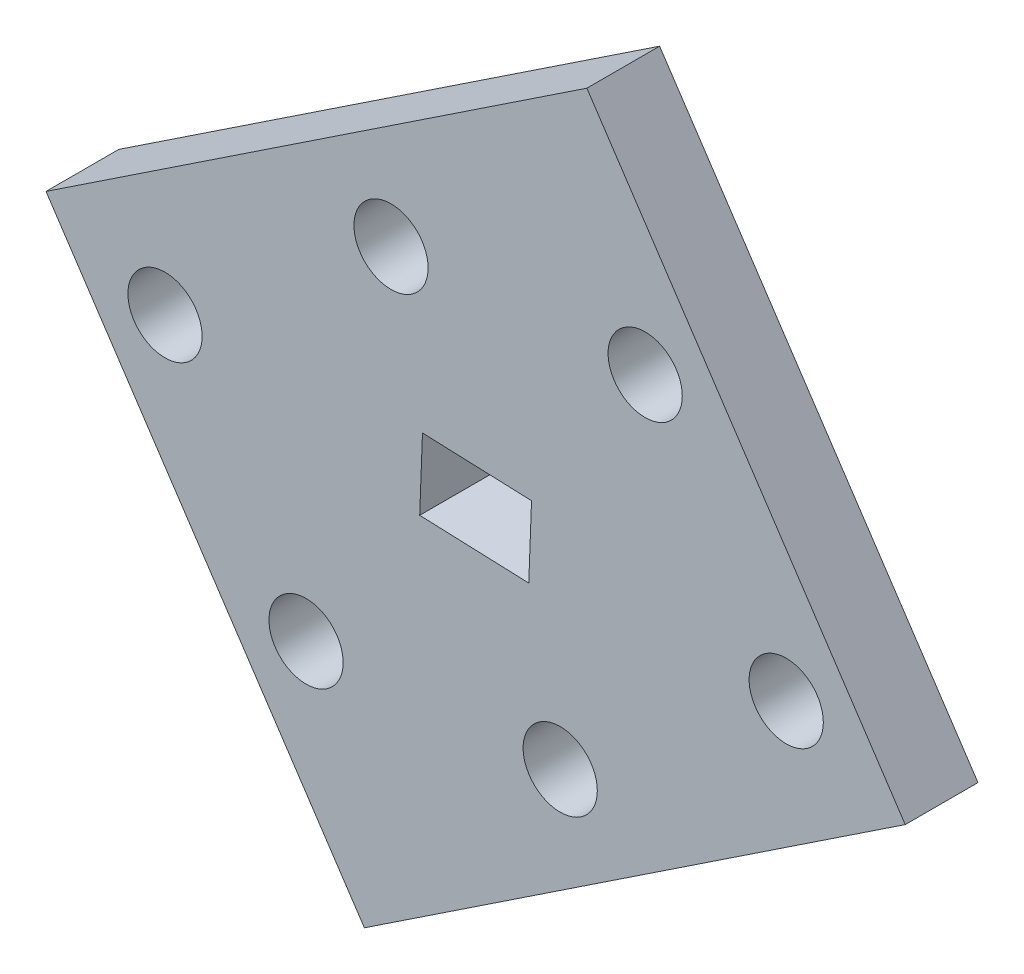
ISO-10303-21;
HEADER;
FILE_DESCRIPTION(('STEP AP214'),'2;1');
FILE_NAME('part.step','',(''),(''),'','','');
FILE_SCHEMA(('AUTOMOTIVE_DESIGN { 1 0 10303 214 1 1 1 1 }'));
ENDSEC;
DATA;
#1=APPLICATION_CONTEXT('core data for automotive mechanical design processes');
#2=APPLICATION_PROTOCOL_DEFINITION('international standard','automotive_design',2000,#1);
#3=PRODUCT_CONTEXT('',#1,'mechanical');
#4=PRODUCT('Part','Part','',(#3));
#5=PRODUCT_RELATED_PRODUCT_CATEGORY('part','',(#4));
#6=PRODUCT_DEFINITION_FORMATION('','',#4);
#7=PRODUCT_DEFINITION_CONTEXT('part definition',#1,'design');
#8=PRODUCT_DEFINITION('design','',#6,#7);
#9=PRODUCT_DEFINITION_SHAPE('','',#8);
#10=(LENGTH_UNIT() NAMED_UNIT(*) SI_UNIT(.MILLI.,.METRE.));
#11=(NAMED_UNIT(*) PLANE_ANGLE_UNIT() SI_UNIT($,.RADIAN.));
#12=(NAMED_UNIT(*) SI_UNIT($,.STERADIAN.) SOLID_ANGLE_UNIT());
#13=UNCERTAINTY_MEASURE_WITH_UNIT(LENGTH_MEASURE(1.E-05),#10,'distance_accuracy_value','');
#14=(GEOMETRIC_REPRESENTATION_CONTEXT(3) GLOBAL_UNCERTAINTY_ASSIGNED_CONTEXT((#13)) GLOBAL_UNIT_ASSIGNED_CONTEXT((#10,
#11,#12)) REPRESENTATION_CONTEXT('',''));
#15=CARTESIAN_POINT('',(0.,0.,0.));
#16=DIRECTION('',(0.,0.,1.));
#17=DIRECTION('',(1.,0.,0.));
#18=AXIS2_PLACEMENT_3D('',#15,#16,#17);
#19=CARTESIAN_POINT('',(-3.66198105174916,-82.9081585743082,-10.));
#20=DIRECTION('',(-0.832588078820921,-0.553892671016044,0.));
#21=DIRECTION('',(0.553892671016044,-0.832588078820921,0.));
#22=AXIS2_PLACEMENT_3D('',#19,#20,#21);
#23=PLANE('',#22);
#24=DIRECTION('',(0.553892671016044,-0.832588078820921,0.));
#25=VECTOR('',#24,1.);
#26=CARTESIAN_POINT('',(-3.66198105174916,-82.9081585743082,0.));
#27=LINE('',#26,#25);
#28=CARTESIAN_POINT('',(-47.4195020620167,-17.1337003474554,0.));
#29=VERTEX_POINT('',#28);
#30=CARTESIAN_POINT('',(-3.66198105174916,-82.9081585743082,0.));
#31=VERTEX_POINT('',#30);
#32=EDGE_CURVE('E166',#29,#31,#27,.T.);
#33=ORIENTED_EDGE('',*,*,#32,.F.);
#34=DIRECTION('',(0.,0.,1.));
#35=VECTOR('',#34,1.);
#36=CARTESIAN_POINT('',(-47.4195020620167,-17.1337003474554,-10.));
#37=LINE('',#36,#35);
#38=CARTESIAN_POINT('',(-47.4195020620167,-17.1337003474554,-10.));
#39=VERTEX_POINT('',#38);
#40=EDGE_CURVE('E11',#39,#29,#37,.T.);
#41=ORIENTED_EDGE('',*,*,#40,.F.);
#42=DIRECTION('',(0.553892671016044,-0.832588078820921,0.));
#43=VECTOR('',#42,1.);
#44=CARTESIAN_POINT('',(-3.66198105174916,-82.9081585743082,-10.));
#45=LINE('',#44,#43);
#46=CARTESIAN_POINT('',(-3.66198105174916,-82.9081585743082,-10.));
#47=VERTEX_POINT('',#46);
#48=EDGE_CURVE('E169',#39,#47,#45,.T.);
#49=ORIENTED_EDGE('',*,*,#48,.T.);
#50=DIRECTION('',(0.,0.,1.));
#51=VECTOR('',#50,1.);
#52=CARTESIAN_POINT('',(-3.66198105174916,-82.9081585743082,-10.));
#53=LINE('',#52,#51);
#54=EDGE_CURVE('E36',#47,#31,#53,.T.);
#55=ORIENTED_EDGE('',*,*,#54,.T.);
#56=EDGE_LOOP('',(#33,#41,#49,#55));
#57=FACE_BOUND('',#56,.T.);
#58=ADVANCED_FACE('F33',(#57),#23,.T.);
#59=CARTESIAN_POINT('',(-47.4195020620167,-17.1337003474554,-10.));
#60=DIRECTION('',(-0.553892671016044,0.832588078820921,0.));
#61=DIRECTION('',(-0.832588078820921,-0.553892671016044,0.));
#62=AXIS2_PLACEMENT_3D('',#59,#60,#61);
#63=PLANE('',#62);
#64=DIRECTION('',(-0.832588078820921,-0.553892671016044,0.));
#65=VECTOR('',#64,1.);
#66=CARTESIAN_POINT('',(-47.4195020620167,-17.1337003474554,0.));
#67=LINE('',#66,#65);
#68=CARTESIAN_POINT('',(26.9156536861616,32.3189629984584,0.));
#69=VERTEX_POINT('',#68);
#70=EDGE_CURVE('E173',#69,#29,#67,.T.);
#71=ORIENTED_EDGE('',*,*,#70,.F.);
#72=DIRECTION('',(0.,0.,1.));
#73=VECTOR('',#72,1.);
#74=CARTESIAN_POINT('',(26.9156536861616,32.3189629984584,-10.));
#75=LINE('',#74,#73);
#76=CARTESIAN_POINT('',(26.9156536861616,32.3189629984584,-10.));
#77=VERTEX_POINT('',#76);
#78=EDGE_CURVE('E41',#77,#69,#75,.T.);
#79=ORIENTED_EDGE('',*,*,#78,.F.);
#80=DIRECTION('',(-0.832588078820921,-0.553892671016044,0.));
#81=VECTOR('',#80,1.);
#82=CARTESIAN_POINT('',(-47.4195020620167,-17.1337003474554,-10.));
#83=LINE('',#82,#81);
#84=EDGE_CURVE('E179',#77,#39,#83,.T.);
#85=ORIENTED_EDGE('',*,*,#84,.T.);
#86=ORIENTED_EDGE('',*,*,#40,.T.);
#87=EDGE_LOOP('',(#71,#79,#85,#86));
#88=FACE_BOUND('',#87,.T.);
#89=ADVANCED_FACE('F205',(#88),#63,.T.);
#90=CARTESIAN_POINT('',(70.6731746964291,-33.4554952283944,-10.));
#91=DIRECTION('',(0.832588078820921,0.553892671016044,0.));
#92=DIRECTION('',(-0.553892671016044,0.832588078820921,0.));
#93=AXIS2_PLACEMENT_3D('',#90,#91,#92);
#94=PLANE('',#93);
#95=DIRECTION('',(-0.553892671016044,0.832588078820921,0.));
#96=VECTOR('',#95,1.);
#97=CARTESIAN_POINT('',(70.6731746964291,-33.4554952283944,0.));
#98=LINE('',#97,#96);
#99=CARTESIAN_POINT('',(70.6731746964291,-33.4554952283944,0.));
#100=VERTEX_POINT('',#99);
#101=EDGE_CURVE('E187',#100,#69,#98,.T.);
#102=ORIENTED_EDGE('',*,*,#101,.F.);
#103=DIRECTION('',(0.,0.,1.));
#104=VECTOR('',#103,1.);
#105=CARTESIAN_POINT('',(70.6731746964291,-33.4554952283944,-10.));
#106=LINE('',#105,#104);
#107=CARTESIAN_POINT('',(70.6731746964291,-33.4554952283944,-10.));
#108=VERTEX_POINT('',#107);
#109=EDGE_CURVE('E192',#108,#100,#106,.T.);
#110=ORIENTED_EDGE('',*,*,#109,.F.);
#111=DIRECTION('',(-0.553892671016044,0.832588078820921,0.));
#112=VECTOR('',#111,1.);
#113=CARTESIAN_POINT('',(70.6731746964291,-33.4554952283944,-10.));
#114=LINE('',#113,#112);
#115=EDGE_CURVE('E176',#108,#77,#114,.T.);
#116=ORIENTED_EDGE('',*,*,#115,.T.);
#117=ORIENTED_EDGE('',*,*,#78,.T.);
#118=EDGE_LOOP('',(#102,#110,#116,#117));
#119=FACE_BOUND('',#118,.T.);
#120=ADVANCED_FACE('F210',(#119),#94,.T.);
#121=CARTESIAN_POINT('',(-3.66198105174916,-82.9081585743082,-10.));
#122=DIRECTION('',(0.553892671016044,-0.832588078820921,0.));
#123=DIRECTION('',(0.832588078820921,0.553892671016044,0.));
#124=AXIS2_PLACEMENT_3D('',#121,#122,#123);
#125=PLANE('',#124);
#126=DIRECTION('',(0.832588078820921,0.553892671016044,0.));
#127=VECTOR('',#126,1.);
#128=CARTESIAN_POINT('',(-3.66198105174916,-82.9081585743082,0.));
#129=LINE('',#128,#127);
#130=EDGE_CURVE('E184',#31,#100,#129,.T.);
#131=ORIENTED_EDGE('',*,*,#130,.F.);
#132=ORIENTED_EDGE('',*,*,#54,.F.);
#133=DIRECTION('',(0.832588078820921,0.553892671016044,0.));
#134=VECTOR('',#133,1.);
#135=CARTESIAN_POINT('',(-3.66198105174916,-82.9081585743082,-10.));
#136=LINE('',#135,#134);
#137=EDGE_CURVE('E172',#47,#108,#136,.T.);
#138=ORIENTED_EDGE('',*,*,#137,.T.);
#139=ORIENTED_EDGE('',*,*,#109,.T.);
#140=EDGE_LOOP('',(#131,#132,#138,#139));
#141=FACE_BOUND('',#140,.T.);
#142=ADVANCED_FACE('F200',(#141),#125,.T.);
#143=CARTESIAN_POINT('',(0.,0.,-10.));
#144=DIRECTION('',(0.,0.,-1.));
#145=DIRECTION('',(-1.,0.,0.));
#146=AXIS2_PLACEMENT_3D('',#143,#144,#145);
#147=PLANE('',#146);
#148=DIRECTION('',(-0.0380921417226303,-0.99927423099917,0.));
#149=VECTOR('',#148,1.);
#150=CARTESIAN_POINT('',(4.32274029332557,-20.0125355700093,-10.));
#151=LINE('',#150,#149);
#152=CARTESIAN_POINT('',(4.32274029332557,-20.0125355700093,-10.));
#153=VERTEX_POINT('',#152);
#154=CARTESIAN_POINT('',(3.94181887609927,-30.005277880001,-10.));
#155=VERTEX_POINT('',#154);
#156=EDGE_CURVE('E108',#153,#155,#151,.T.);
#157=ORIENTED_EDGE('',*,*,#156,.T.);
#158=DIRECTION('',(0.99927423099917,-0.0380921417226301,0.));
#159=VECTOR('',#158,1.);
#160=CARTESIAN_POINT('',(3.94181887609927,-30.005277880001,-10.));
#161=LINE('',#160,#159);
#162=CARTESIAN_POINT('',(18.9309323410868,-30.5766600058405,-10.));
#163=VERTEX_POINT('',#162);
#164=EDGE_CURVE('E97',#155,#163,#161,.T.);
#165=ORIENTED_EDGE('',*,*,#164,.T.);
#166=DIRECTION('',(0.0380921417226301,0.99927423099917,0.));
#167=VECTOR('',#166,1.);
#168=CARTESIAN_POINT('',(19.3118537583131,-20.5839176958488,-10.));
#169=LINE('',#168,#167);
#170=CARTESIAN_POINT('',(19.3118537583131,-20.5839176958488,-10.));
#171=VERTEX_POINT('',#170);
#172=EDGE_CURVE('E119',#163,#171,#169,.T.);
#173=ORIENTED_EDGE('',*,*,#172,.T.);
#174=DIRECTION('',(-0.99927423099917,0.0380921417226299,0.));
#175=VECTOR('',#174,1.);
#176=CARTESIAN_POINT('',(4.32274029332557,-20.0125355700093,-10.));
#177=LINE('',#176,#175);
#178=EDGE_CURVE('E115',#171,#153,#177,.T.);
#179=ORIENTED_EDGE('',*,*,#178,.T.);
#180=EDGE_LOOP('',(#157,#165,#173,#179));
#181=FACE_BOUND('',#180,.T.);
#182=CARTESIAN_POINT('',(-31.0621775440748,-23.6673007801983,-10.));
#183=DIRECTION('',(0.,0.,1.));
#184=DIRECTION('',(1.,0.,0.));
#185=AXIS2_PLACEMENT_3D('',#182,#183,#184);
#186=CIRCLE('',#185,5.1);
#187=CARTESIAN_POINT('',(-25.9621775440748,-23.6673007801983,-10.));
#188=VERTEX_POINT('',#187);
#189=EDGE_CURVE('E133',#188,#188,#186,.T.);
#190=ORIENTED_EDGE('',*,*,#189,.T.);
#191=EDGE_LOOP('',(#190));
#192=FACE_BOUND('',#191,.T.);
#193=CARTESIAN_POINT('',(-11.6759340585133,-52.8078835389305,-10.));
#194=DIRECTION('',(0.,0.,1.));
#195=DIRECTION('',(1.,0.,0.));
#196=AXIS2_PLACEMENT_3D('',#193,#194,#195);
#197=CIRCLE('',#196,5.1);
#198=CARTESIAN_POINT('',(-6.57593405851329,-52.8078835389305,-10.));
#199=VERTEX_POINT('',#198);
#200=EDGE_CURVE('E139',#199,#199,#197,.T.);
#201=ORIENTED_EDGE('',*,*,#200,.T.);
#202=EDGE_LOOP('',(#201));
#203=FACE_BOUND('',#202,.T.);
#204=CARTESIAN_POINT('',(23.2536726344124,-50.5891955758498,-10.));
#205=DIRECTION('',(0.,0.,1.));
#206=DIRECTION('',(1.,0.,0.));
#207=AXIS2_PLACEMENT_3D('',#204,#205,#206);
#208=CIRCLE('',#207,5.1);
#209=CARTESIAN_POINT('',(28.3536726344124,-50.5891955758498,-10.));
#210=VERTEX_POINT('',#209);
#211=EDGE_CURVE('E145',#210,#210,#208,.T.);
#212=ORIENTED_EDGE('',*,*,#211,.T.);
#213=EDGE_LOOP('',(#212));
#214=FACE_BOUND('',#213,.T.);
#215=CARTESIAN_POINT('',(54.3158501784872,-26.9218947956515,-10.));
#216=DIRECTION('',(0.,0.,1.));
#217=DIRECTION('',(1.,0.,0.));
#218=AXIS2_PLACEMENT_3D('',#215,#216,#217);
#219=CIRCLE('',#218,5.1000000000002);
#220=CARTESIAN_POINT('',(59.4158501784874,-26.9218947956515,-10.));
#221=VERTEX_POINT('',#220);
#222=EDGE_CURVE('E151',#221,#221,#219,.T.);
#223=ORIENTED_EDGE('',*,*,#222,.T.);
#224=EDGE_LOOP('',(#223));
#225=FACE_BOUND('',#224,.T.);
#226=CARTESIAN_POINT('',(34.9296066929257,2.21868796308074,-10.));
#227=DIRECTION('',(0.,0.,1.));
#228=DIRECTION('',(1.,0.,0.));
#229=AXIS2_PLACEMENT_3D('',#226,#227,#228);
#230=CIRCLE('',#229,5.10000000000001);
#231=CARTESIAN_POINT('',(40.0296066929257,2.21868796308074,-10.));
#232=VERTEX_POINT('',#231);
#233=EDGE_CURVE('E157',#232,#232,#230,.T.);
#234=ORIENTED_EDGE('',*,*,#233,.T.);
#235=EDGE_LOOP('',(#234));
#236=FACE_BOUND('',#235,.T.);
#237=CARTESIAN_POINT('',(0.,0.,-10.));
#238=DIRECTION('',(0.,0.,1.));
#239=DIRECTION('',(1.,0.,0.));
#240=AXIS2_PLACEMENT_3D('',#237,#238,#239);
#241=CIRCLE('',#240,5.10000000000001);
#242=CARTESIAN_POINT('',(5.1,0.,-10.));
#243=VERTEX_POINT('',#242);
#244=EDGE_CURVE('E163',#243,#243,#241,.T.);
#245=ORIENTED_EDGE('',*,*,#244,.T.);
#246=EDGE_LOOP('',(#245));
#247=FACE_BOUND('',#246,.T.);
#248=ORIENTED_EDGE('',*,*,#48,.F.);
#249=ORIENTED_EDGE('',*,*,#84,.F.);
#250=ORIENTED_EDGE('',*,*,#115,.F.);
#251=ORIENTED_EDGE('',*,*,#137,.F.);
#252=EDGE_LOOP('',(#248,#249,#250,#251));
#253=FACE_BOUND('',#252,.T.);
#254=ADVANCED_FACE('F113',(#181,#192,#203,#214,#225,#236,#247,#253),#147,.T.);
#255=CARTESIAN_POINT('',(0.,0.,0.));
#256=DIRECTION('',(0.,0.,-1.));
#257=DIRECTION('',(-1.,0.,0.));
#258=AXIS2_PLACEMENT_3D('',#255,#256,#257);
#259=PLANE('',#258);
#260=DIRECTION('',(0.99927423099917,-0.0380921417226301,0.));
#261=VECTOR('',#260,1.);
#262=CARTESIAN_POINT('',(3.94181887609927,-30.005277880001,0.));
#263=LINE('',#262,#261);
#264=CARTESIAN_POINT('',(3.94181887609927,-30.005277880001,0.));
#265=VERTEX_POINT('',#264);
#266=CARTESIAN_POINT('',(18.9309323410868,-30.5766600058405,0.));
#267=VERTEX_POINT('',#266);
#268=EDGE_CURVE('E117',#265,#267,#263,.T.);
#269=ORIENTED_EDGE('',*,*,#268,.F.);
#270=DIRECTION('',(-0.0380921417226303,-0.99927423099917,0.));
#271=VECTOR('',#270,1.);
#272=CARTESIAN_POINT('',(4.32274029332557,-20.0125355700093,0.));
#273=LINE('',#272,#271);
#274=CARTESIAN_POINT('',(4.32274029332557,-20.0125355700093,0.));
#275=VERTEX_POINT('',#274);
#276=EDGE_CURVE('E57',#275,#265,#273,.T.);
#277=ORIENTED_EDGE('',*,*,#276,.F.);
#278=DIRECTION('',(-0.99927423099917,0.0380921417226299,0.));
#279=VECTOR('',#278,1.);
#280=CARTESIAN_POINT('',(4.32274029332557,-20.0125355700093,0.));
#281=LINE('',#280,#279);
#282=CARTESIAN_POINT('',(19.3118537583131,-20.5839176958488,0.));
#283=VERTEX_POINT('',#282);
#284=EDGE_CURVE('E110',#283,#275,#281,.T.);
#285=ORIENTED_EDGE('',*,*,#284,.F.);
#286=DIRECTION('',(0.0380921417226301,0.99927423099917,0.));
#287=VECTOR('',#286,1.);
#288=CARTESIAN_POINT('',(19.3118537583131,-20.5839176958488,0.));
#289=LINE('',#288,#287);
#290=EDGE_CURVE('E124',#267,#283,#289,.T.);
#291=ORIENTED_EDGE('',*,*,#290,.F.);
#292=EDGE_LOOP('',(#269,#277,#285,#291));
#293=FACE_BOUND('',#292,.T.);
#294=CARTESIAN_POINT('',(-31.0621775440748,-23.6673007801983,0.));
#295=DIRECTION('',(0.,0.,1.));
#296=DIRECTION('',(1.,0.,0.));
#297=AXIS2_PLACEMENT_3D('',#294,#295,#296);
#298=CIRCLE('',#297,5.1);
#299=CARTESIAN_POINT('',(-25.9621775440748,-23.6673007801983,0.));
#300=VERTEX_POINT('',#299);
#301=EDGE_CURVE('E104',#300,#300,#298,.T.);
#302=ORIENTED_EDGE('',*,*,#301,.F.);
#303=EDGE_LOOP('',(#302));
#304=FACE_BOUND('',#303,.T.);
#305=CARTESIAN_POINT('',(-11.6759340585133,-52.8078835389305,0.));
#306=DIRECTION('',(0.,0.,1.));
#307=DIRECTION('',(1.,0.,0.));
#308=AXIS2_PLACEMENT_3D('',#305,#306,#307);
#309=CIRCLE('',#308,5.1);
#310=CARTESIAN_POINT('',(-6.57593405851329,-52.8078835389305,0.));
#311=VERTEX_POINT('',#310);
#312=EDGE_CURVE('E136',#311,#311,#309,.T.);
#313=ORIENTED_EDGE('',*,*,#312,.F.);
#314=EDGE_LOOP('',(#313));
#315=FACE_BOUND('',#314,.T.);
#316=CARTESIAN_POINT('',(23.2536726344124,-50.5891955758498,0.));
#317=DIRECTION('',(0.,0.,1.));
#318=DIRECTION('',(1.,0.,0.));
#319=AXIS2_PLACEMENT_3D('',#316,#317,#318);
#320=CIRCLE('',#319,5.1);
#321=CARTESIAN_POINT('',(28.3536726344124,-50.5891955758498,0.));
#322=VERTEX_POINT('',#321);
#323=EDGE_CURVE('E142',#322,#322,#320,.T.);
#324=ORIENTED_EDGE('',*,*,#323,.F.);
#325=EDGE_LOOP('',(#324));
#326=FACE_BOUND('',#325,.T.);
#327=CARTESIAN_POINT('',(54.3158501784872,-26.9218947956515,0.));
#328=DIRECTION('',(0.,0.,1.));
#329=DIRECTION('',(1.,0.,0.));
#330=AXIS2_PLACEMENT_3D('',#327,#328,#329);
#331=CIRCLE('',#330,5.1000000000002);
#332=CARTESIAN_POINT('',(59.4158501784874,-26.9218947956515,0.));
#333=VERTEX_POINT('',#332);
#334=EDGE_CURVE('E148',#333,#333,#331,.T.);
#335=ORIENTED_EDGE('',*,*,#334,.F.);
#336=EDGE_LOOP('',(#335));
#337=FACE_BOUND('',#336,.T.);
#338=CARTESIAN_POINT('',(34.9296066929257,2.21868796308074,0.));
#339=DIRECTION('',(0.,0.,1.));
#340=DIRECTION('',(1.,0.,0.));
#341=AXIS2_PLACEMENT_3D('',#338,#339,#340);
#342=CIRCLE('',#341,5.10000000000001);
#343=CARTESIAN_POINT('',(40.0296066929257,2.21868796308074,0.));
#344=VERTEX_POINT('',#343);
#345=EDGE_CURVE('E154',#344,#344,#342,.T.);
#346=ORIENTED_EDGE('',*,*,#345,.F.);
#347=EDGE_LOOP('',(#346));
#348=FACE_BOUND('',#347,.T.);
#349=CARTESIAN_POINT('',(0.,0.,0.));
#350=DIRECTION('',(0.,0.,1.));
#351=DIRECTION('',(1.,0.,0.));
#352=AXIS2_PLACEMENT_3D('',#349,#350,#351);
#353=CIRCLE('',#352,5.10000000000001);
#354=CARTESIAN_POINT('',(5.1,0.,0.));
#355=VERTEX_POINT('',#354);
#356=EDGE_CURVE('E160',#355,#355,#353,.T.);
#357=ORIENTED_EDGE('',*,*,#356,.F.);
#358=EDGE_LOOP('',(#357));
#359=FACE_BOUND('',#358,.T.);
#360=ORIENTED_EDGE('',*,*,#32,.T.);
#361=ORIENTED_EDGE('',*,*,#130,.T.);
#362=ORIENTED_EDGE('',*,*,#101,.T.);
#363=ORIENTED_EDGE('',*,*,#70,.T.);
#364=EDGE_LOOP('',(#360,#361,#362,#363));
#365=FACE_BOUND('',#364,.T.);
#366=ADVANCED_FACE('F202',(#293,#304,#315,#326,#337,#348,#359,#365),#259,.F.);
#367=CARTESIAN_POINT('',(0.,0.,-10.));
#368=DIRECTION('',(0.,0.,1.));
#369=DIRECTION('',(1.,0.,0.));
#370=AXIS2_PLACEMENT_3D('',#367,#368,#369);
#371=CYLINDRICAL_SURFACE('',#370,5.10000000000001);
#372=ORIENTED_EDGE('',*,*,#244,.F.);
#373=EDGE_LOOP('',(#372));
#374=FACE_BOUND('',#373,.T.);
#375=ORIENTED_EDGE('',*,*,#356,.T.);
#376=EDGE_LOOP('',(#375));
#377=FACE_BOUND('',#376,.T.);
#378=ADVANCED_FACE('F242',(#374,#377),#371,.F.);
#379=CARTESIAN_POINT('',(34.9296066929257,2.21868796308074,-10.));
#380=DIRECTION('',(0.,0.,1.));
#381=DIRECTION('',(1.,0.,0.));
#382=AXIS2_PLACEMENT_3D('',#379,#380,#381);
#383=CYLINDRICAL_SURFACE('',#382,5.10000000000001);
#384=ORIENTED_EDGE('',*,*,#233,.F.);
#385=EDGE_LOOP('',(#384));
#386=FACE_BOUND('',#385,.T.);
#387=ORIENTED_EDGE('',*,*,#345,.T.);
#388=EDGE_LOOP('',(#387));
#389=FACE_BOUND('',#388,.T.);
#390=ADVANCED_FACE('F247',(#386,#389),#383,.F.);
#391=CARTESIAN_POINT('',(54.3158501784872,-26.9218947956515,-10.));
#392=DIRECTION('',(0.,0.,1.));
#393=DIRECTION('',(1.,0.,0.));
#394=AXIS2_PLACEMENT_3D('',#391,#392,#393);
#395=CYLINDRICAL_SURFACE('',#394,5.1000000000002);
#396=ORIENTED_EDGE('',*,*,#222,.F.);
#397=EDGE_LOOP('',(#396));
#398=FACE_BOUND('',#397,.T.);
#399=ORIENTED_EDGE('',*,*,#334,.T.);
#400=EDGE_LOOP('',(#399));
#401=FACE_BOUND('',#400,.T.);
#402=ADVANCED_FACE('F259',(#398,#401),#395,.F.);
#403=CARTESIAN_POINT('',(23.2536726344124,-50.5891955758498,-10.));
#404=DIRECTION('',(0.,0.,1.));
#405=DIRECTION('',(1.,0.,0.));
#406=AXIS2_PLACEMENT_3D('',#403,#404,#405);
#407=CYLINDRICAL_SURFACE('',#406,5.1);
#408=ORIENTED_EDGE('',*,*,#211,.F.);
#409=EDGE_LOOP('',(#408));
#410=FACE_BOUND('',#409,.T.);
#411=ORIENTED_EDGE('',*,*,#323,.T.);
#412=EDGE_LOOP('',(#411));
#413=FACE_BOUND('',#412,.T.);
#414=ADVANCED_FACE('F269',(#410,#413),#407,.F.);
#415=CARTESIAN_POINT('',(-11.6759340585133,-52.8078835389305,-10.));
#416=DIRECTION('',(0.,0.,1.));
#417=DIRECTION('',(1.,0.,0.));
#418=AXIS2_PLACEMENT_3D('',#415,#416,#417);
#419=CYLINDRICAL_SURFACE('',#418,5.1);
#420=ORIENTED_EDGE('',*,*,#200,.F.);
#421=EDGE_LOOP('',(#420));
#422=FACE_BOUND('',#421,.T.);
#423=ORIENTED_EDGE('',*,*,#312,.T.);
#424=EDGE_LOOP('',(#423));
#425=FACE_BOUND('',#424,.T.);
#426=ADVANCED_FACE('F279',(#422,#425),#419,.F.);
#427=CARTESIAN_POINT('',(-31.0621775440748,-23.6673007801983,-10.));
#428=DIRECTION('',(0.,0.,1.));
#429=DIRECTION('',(1.,0.,0.));
#430=AXIS2_PLACEMENT_3D('',#427,#428,#429);
#431=CYLINDRICAL_SURFACE('',#430,5.1);
#432=ORIENTED_EDGE('',*,*,#189,.F.);
#433=EDGE_LOOP('',(#432));
#434=FACE_BOUND('',#433,.T.);
#435=ORIENTED_EDGE('',*,*,#301,.T.);
#436=EDGE_LOOP('',(#435));
#437=FACE_BOUND('',#436,.T.);
#438=ADVANCED_FACE('F289',(#434,#437),#431,.F.);
#439=CARTESIAN_POINT('',(4.32274029332557,-20.0125355700093,-10.001));
#440=DIRECTION('',(-0.99927423099917,0.0380921417226303,0.));
#441=DIRECTION('',(-0.0380921417226303,-0.99927423099917,0.));
#442=AXIS2_PLACEMENT_3D('',#439,#440,#441);
#443=PLANE('',#442);
#444=DIRECTION('',(0.,0.,1.));
#445=VECTOR('',#444,1.);
#446=CARTESIAN_POINT('',(4.32274029332557,-20.0125355700093,-10.001));
#447=LINE('',#446,#445);
#448=EDGE_CURVE('E105',#153,#275,#447,.T.);
#449=ORIENTED_EDGE('',*,*,#448,.T.);
#450=ORIENTED_EDGE('',*,*,#276,.T.);
#451=DIRECTION('',(0.,0.,1.));
#452=VECTOR('',#451,1.);
#453=CARTESIAN_POINT('',(3.94181887609927,-30.005277880001,-10.001));
#454=LINE('',#453,#452);
#455=EDGE_CURVE('E99',#155,#265,#454,.T.);
#456=ORIENTED_EDGE('',*,*,#455,.F.);
#457=ORIENTED_EDGE('',*,*,#156,.F.);
#458=EDGE_LOOP('',(#449,#450,#456,#457));
#459=FACE_BOUND('',#458,.T.);
#460=ADVANCED_FACE('F107',(#459),#443,.F.);
#461=CARTESIAN_POINT('',(4.32274029332557,-20.0125355700093,-10.001));
#462=DIRECTION('',(0.0380921417226299,0.99927423099917,0.));
#463=DIRECTION('',(-0.99927423099917,0.0380921417226299,0.));
#464=AXIS2_PLACEMENT_3D('',#461,#462,#463);
#465=PLANE('',#464);
#466=DIRECTION('',(0.,0.,1.));
#467=VECTOR('',#466,1.);
#468=CARTESIAN_POINT('',(19.3118537583131,-20.5839176958488,-10.001));
#469=LINE('',#468,#467);
#470=EDGE_CURVE('E130',#171,#283,#469,.T.);
#471=ORIENTED_EDGE('',*,*,#470,.T.);
#472=ORIENTED_EDGE('',*,*,#284,.T.);
#473=ORIENTED_EDGE('',*,*,#448,.F.);
#474=ORIENTED_EDGE('',*,*,#178,.F.);
#475=EDGE_LOOP('',(#471,#472,#473,#474));
#476=FACE_BOUND('',#475,.T.);
#477=ADVANCED_FACE('F321',(#476),#465,.F.);
#478=CARTESIAN_POINT('',(19.3118537583131,-20.5839176958488,-10.001));
#479=DIRECTION('',(0.99927423099917,-0.0380921417226301,0.));
#480=DIRECTION('',(0.0380921417226301,0.99927423099917,0.));
#481=AXIS2_PLACEMENT_3D('',#478,#479,#480);
#482=PLANE('',#481);
#483=DIRECTION('',(0.,0.,1.));
#484=VECTOR('',#483,1.);
#485=CARTESIAN_POINT('',(18.9309323410868,-30.5766600058405,-10.001));
#486=LINE('',#485,#484);
#487=EDGE_CURVE('E49',#163,#267,#486,.T.);
#488=ORIENTED_EDGE('',*,*,#487,.T.);
#489=ORIENTED_EDGE('',*,*,#290,.T.);
#490=ORIENTED_EDGE('',*,*,#470,.F.);
#491=ORIENTED_EDGE('',*,*,#172,.F.);
#492=EDGE_LOOP('',(#488,#489,#490,#491));
#493=FACE_BOUND('',#492,.T.);
#494=ADVANCED_FACE('F330',(#493),#482,.F.);
#495=CARTESIAN_POINT('',(3.94181887609927,-30.005277880001,-10.001));
#496=DIRECTION('',(-0.0380921417226301,-0.99927423099917,0.));
#497=DIRECTION('',(0.99927423099917,-0.0380921417226301,0.));
#498=AXIS2_PLACEMENT_3D('',#495,#496,#497);
#499=PLANE('',#498);
#500=ORIENTED_EDGE('',*,*,#455,.T.);
#501=ORIENTED_EDGE('',*,*,#268,.T.);
#502=ORIENTED_EDGE('',*,*,#487,.F.);
#503=ORIENTED_EDGE('',*,*,#164,.F.);
#504=EDGE_LOOP('',(#500,#501,#502,#503));
#505=FACE_BOUND('',#504,.T.);
#506=ADVANCED_FACE('F98',(#505),#499,.F.);
#507=CLOSED_SHELL('',(#58,#89,#120,#142,#254,#366,#378,#390,#402,#414,#426,#438,#460,#477,#494,#506));
#508=MANIFOLD_SOLID_BREP('B2',#507);
#509=ADVANCED_BREP_SHAPE_REPRESENTATION('',(#18,#508),#14);
#510=SHAPE_DEFINITION_REPRESENTATION(#9,#509);
ENDSEC;
END-ISO-10303-21;
